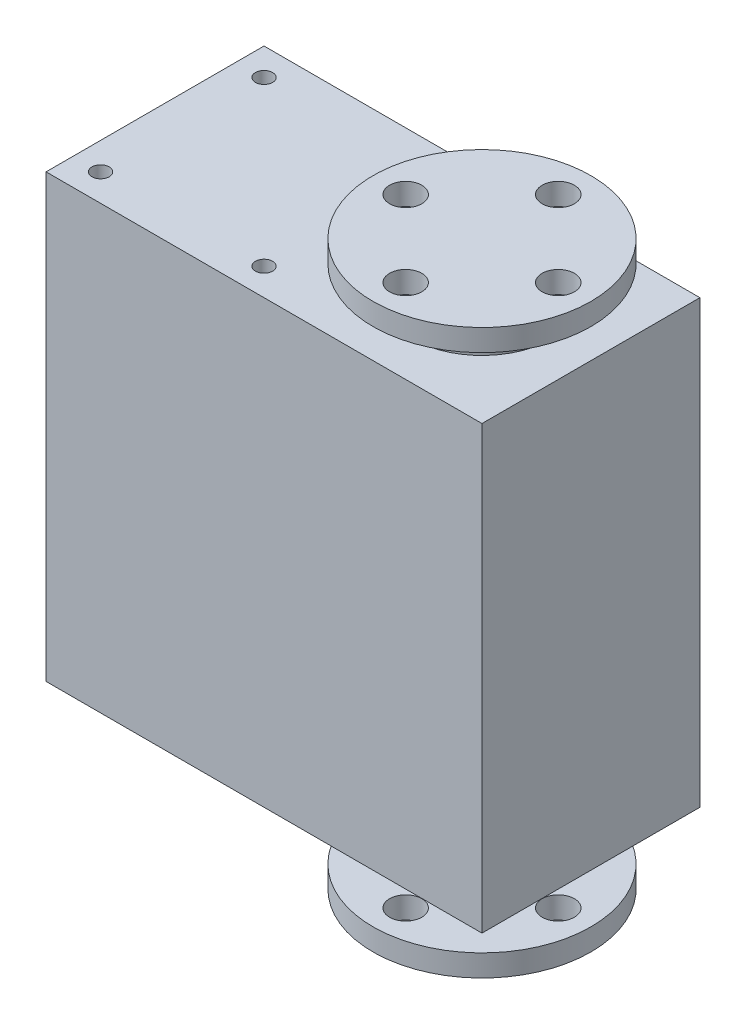
ISO-10303-21;
HEADER;
FILE_DESCRIPTION(('STEP AP214'),'2;1');
FILE_NAME('part.step','',(''),(''),'','','');
FILE_SCHEMA(('AUTOMOTIVE_DESIGN { 1 0 10303 214 1 1 1 1 }'));
ENDSEC;
DATA;
#1=APPLICATION_CONTEXT('core data for automotive mechanical design processes');
#2=APPLICATION_PROTOCOL_DEFINITION('international standard','automotive_design',2000,#1);
#3=PRODUCT_CONTEXT('',#1,'mechanical');
#4=PRODUCT('Part','Part','',(#3));
#5=PRODUCT_RELATED_PRODUCT_CATEGORY('part','',(#4));
#6=PRODUCT_DEFINITION_FORMATION('','',#4);
#7=PRODUCT_DEFINITION_CONTEXT('part definition',#1,'design');
#8=PRODUCT_DEFINITION('design','',#6,#7);
#9=PRODUCT_DEFINITION_SHAPE('','',#8);
#10=(LENGTH_UNIT() NAMED_UNIT(*) SI_UNIT(.MILLI.,.METRE.));
#11=(NAMED_UNIT(*) PLANE_ANGLE_UNIT() SI_UNIT($,.RADIAN.));
#12=(NAMED_UNIT(*) SI_UNIT($,.STERADIAN.) SOLID_ANGLE_UNIT());
#13=UNCERTAINTY_MEASURE_WITH_UNIT(LENGTH_MEASURE(1.E-05),#10,'distance_accuracy_value','');
#14=(GEOMETRIC_REPRESENTATION_CONTEXT(3) GLOBAL_UNCERTAINTY_ASSIGNED_CONTEXT((#13)) GLOBAL_UNIT_ASSIGNED_CONTEXT((#10,
#11,#12)) REPRESENTATION_CONTEXT('',''));
#15=CARTESIAN_POINT('',(0.,0.,0.));
#16=DIRECTION('',(0.,0.,1.));
#17=DIRECTION('',(1.,0.,0.));
#18=AXIS2_PLACEMENT_3D('',#15,#16,#17);
#19=CARTESIAN_POINT('',(0.,0.,20.));
#20=DIRECTION('',(0.,1.,0.));
#21=DIRECTION('',(0.,0.,1.));
#22=AXIS2_PLACEMENT_3D('',#19,#20,#21);
#23=PLANE('',#22);
#24=CARTESIAN_POINT('',(9.8,0.,17.5182537414104));
#25=DIRECTION('',(0.,-1.,0.));
#26=DIRECTION('',(1.,0.,0.));
#27=AXIS2_PLACEMENT_3D('',#24,#25,#26);
#28=CIRCLE('',#27,0.79);
#29=CARTESIAN_POINT('',(10.59,0.,17.5182537414104));
#30=VERTEX_POINT('',#29);
#31=EDGE_CURVE('E239',#30,#30,#28,.T.);
#32=ORIENTED_EDGE('',*,*,#31,.F.);
#33=EDGE_LOOP('',(#32));
#34=FACE_BOUND('',#33,.T.);
#35=CARTESIAN_POINT('',(9.8,0.,3.51825374141041));
#36=DIRECTION('',(0.,-1.,0.));
#37=DIRECTION('',(1.,0.,0.));
#38=AXIS2_PLACEMENT_3D('',#35,#36,#37);
#39=CIRCLE('',#38,0.79);
#40=CARTESIAN_POINT('',(10.59,0.,3.51825374141041));
#41=VERTEX_POINT('',#40);
#42=EDGE_CURVE('E223',#41,#41,#39,.T.);
#43=ORIENTED_EDGE('',*,*,#42,.F.);
#44=EDGE_LOOP('',(#43));
#45=FACE_BOUND('',#44,.T.);
#46=DIRECTION('',(1.,0.,0.));
#47=VECTOR('',#46,1.);
#48=CARTESIAN_POINT('',(0.,0.,0.));
#49=LINE('',#48,#47);
#50=CARTESIAN_POINT('',(0.,0.,0.));
#51=VERTEX_POINT('',#50);
#52=CARTESIAN_POINT('',(40.,0.,0.));
#53=VERTEX_POINT('',#52);
#54=EDGE_CURVE('E82',#51,#53,#49,.T.);
#55=ORIENTED_EDGE('',*,*,#54,.T.);
#56=DIRECTION('',(0.,0.,-1.));
#57=VECTOR('',#56,1.);
#58=CARTESIAN_POINT('',(40.,0.,20.));
#59=LINE('',#58,#57);
#60=CARTESIAN_POINT('',(40.,0.,20.));
#61=VERTEX_POINT('',#60);
#62=EDGE_CURVE('E21',#61,#53,#59,.T.);
#63=ORIENTED_EDGE('',*,*,#62,.F.);
#64=DIRECTION('',(1.,0.,0.));
#65=VECTOR('',#64,1.);
#66=CARTESIAN_POINT('',(0.,0.,20.));
#67=LINE('',#66,#65);
#68=CARTESIAN_POINT('',(0.,0.,20.));
#69=VERTEX_POINT('',#68);
#70=EDGE_CURVE('E64',#69,#61,#67,.T.);
#71=ORIENTED_EDGE('',*,*,#70,.F.);
#72=DIRECTION('',(0.,0.,-1.));
#73=VECTOR('',#72,1.);
#74=CARTESIAN_POINT('',(0.,0.,20.));
#75=LINE('',#74,#73);
#76=EDGE_CURVE('E95',#69,#51,#75,.T.);
#77=ORIENTED_EDGE('',*,*,#76,.T.);
#78=EDGE_LOOP('',(#55,#63,#71,#77));
#79=FACE_BOUND('',#78,.T.);
#80=CARTESIAN_POINT('',(30.,0.,10.));
#81=DIRECTION('',(0.,1.,0.));
#82=DIRECTION('',(1.,0.,0.));
#83=AXIS2_PLACEMENT_3D('',#80,#81,#82);
#84=CIRCLE('',#83,6.5);
#85=CARTESIAN_POINT('',(36.5,0.,10.));
#86=VERTEX_POINT('',#85);
#87=EDGE_CURVE('E111',#86,#86,#84,.T.);
#88=ORIENTED_EDGE('',*,*,#87,.T.);
#89=EDGE_LOOP('',(#88));
#90=FACE_BOUND('',#89,.T.);
#91=CARTESIAN_POINT('',(23.2,0.,2.));
#92=DIRECTION('',(0.,-1.,0.));
#93=DIRECTION('',(1.,0.,0.));
#94=AXIS2_PLACEMENT_3D('',#91,#92,#93);
#95=CIRCLE('',#94,0.79);
#96=CARTESIAN_POINT('',(23.99,0.,2.));
#97=VERTEX_POINT('',#96);
#98=EDGE_CURVE('E215',#97,#97,#95,.T.);
#99=ORIENTED_EDGE('',*,*,#98,.F.);
#100=EDGE_LOOP('',(#99));
#101=FACE_BOUND('',#100,.T.);
#102=CARTESIAN_POINT('',(2.8,0.,10.0430152254788));
#103=DIRECTION('',(0.,-1.,0.));
#104=DIRECTION('',(1.,0.,0.));
#105=AXIS2_PLACEMENT_3D('',#102,#103,#104);
#106=CIRCLE('',#105,0.79);
#107=CARTESIAN_POINT('',(3.59,0.,10.0430152254788));
#108=VERTEX_POINT('',#107);
#109=EDGE_CURVE('E231',#108,#108,#106,.T.);
#110=ORIENTED_EDGE('',*,*,#109,.F.);
#111=EDGE_LOOP('',(#110));
#112=FACE_BOUND('',#111,.T.);
#113=CARTESIAN_POINT('',(23.2,0.,17.21));
#114=DIRECTION('',(0.,-1.,0.));
#115=DIRECTION('',(1.,0.,0.));
#116=AXIS2_PLACEMENT_3D('',#113,#114,#115);
#117=CIRCLE('',#116,0.79);
#118=CARTESIAN_POINT('',(23.99,0.,17.21));
#119=VERTEX_POINT('',#118);
#120=EDGE_CURVE('E247',#119,#119,#117,.T.);
#121=ORIENTED_EDGE('',*,*,#120,.F.);
#122=EDGE_LOOP('',(#121));
#123=FACE_BOUND('',#122,.T.);
#124=ADVANCED_FACE('F17',(#34,#45,#79,#90,#101,#112,#123),#23,.F.);
#125=CARTESIAN_POINT('',(30.,45.2,10.));
#126=DIRECTION('',(0.,1.,0.));
#127=DIRECTION('',(0.,0.,1.));
#128=AXIS2_PLACEMENT_3D('',#125,#126,#127);
#129=PLANE('',#128);
#130=CARTESIAN_POINT('',(30.,45.2,2.99999999999993));
#131=DIRECTION('',(0.,-1.,0.));
#132=DIRECTION('',(-1.,0.,0.));
#133=AXIS2_PLACEMENT_3D('',#130,#131,#132);
#134=CIRCLE('',#133,1.47782604588);
#135=CARTESIAN_POINT('',(28.52217395412,45.2,2.99999999999993));
#136=VERTEX_POINT('',#135);
#137=EDGE_CURVE('E199',#136,#136,#134,.T.);
#138=ORIENTED_EDGE('',*,*,#137,.T.);
#139=EDGE_LOOP('',(#138));
#140=FACE_BOUND('',#139,.T.);
#141=CARTESIAN_POINT('',(30.,45.2,17.));
#142=DIRECTION('',(0.,-1.,0.));
#143=DIRECTION('',(1.,0.,0.));
#144=AXIS2_PLACEMENT_3D('',#141,#142,#143);
#145=CIRCLE('',#144,1.47782604588);
#146=CARTESIAN_POINT('',(31.47782604588,45.2,17.));
#147=VERTEX_POINT('',#146);
#148=EDGE_CURVE('E183',#147,#147,#145,.T.);
#149=ORIENTED_EDGE('',*,*,#148,.T.);
#150=EDGE_LOOP('',(#149));
#151=FACE_BOUND('',#150,.T.);
#152=CARTESIAN_POINT('',(30.,45.2,10.));
#153=DIRECTION('',(0.,1.,0.));
#154=DIRECTION('',(1.,0.,0.));
#155=AXIS2_PLACEMENT_3D('',#152,#153,#154);
#156=CIRCLE('',#155,10.);
#157=CARTESIAN_POINT('',(40.,45.2,10.));
#158=VERTEX_POINT('',#157);
#159=EDGE_CURVE('E130',#158,#158,#156,.T.);
#160=ORIENTED_EDGE('',*,*,#159,.T.);
#161=EDGE_LOOP('',(#160));
#162=FACE_BOUND('',#161,.T.);
#163=CARTESIAN_POINT('',(23.,45.2,10.));
#164=DIRECTION('',(0.,-1.,0.));
#165=DIRECTION('',(0.,0.,1.));
#166=AXIS2_PLACEMENT_3D('',#163,#164,#165);
#167=CIRCLE('',#166,1.47782604588);
#168=CARTESIAN_POINT('',(23.,45.2,11.47782604588));
#169=VERTEX_POINT('',#168);
#170=EDGE_CURVE('E191',#169,#169,#167,.T.);
#171=ORIENTED_EDGE('',*,*,#170,.T.);
#172=EDGE_LOOP('',(#171));
#173=FACE_BOUND('',#172,.T.);
#174=CARTESIAN_POINT('',(37.,45.2,10.));
#175=DIRECTION('',(0.,-1.,0.));
#176=DIRECTION('',(0.,0.,-1.));
#177=AXIS2_PLACEMENT_3D('',#174,#175,#176);
#178=CIRCLE('',#177,1.47782604588);
#179=CARTESIAN_POINT('',(37.,45.2,8.52217395412));
#180=VERTEX_POINT('',#179);
#181=EDGE_CURVE('E207',#180,#180,#178,.T.);
#182=ORIENTED_EDGE('',*,*,#181,.T.);
#183=EDGE_LOOP('',(#182));
#184=FACE_BOUND('',#183,.T.);
#185=ADVANCED_FACE('F325',(#140,#151,#162,#173,#184),#129,.T.);
#186=CARTESIAN_POINT('',(30.,43.2,10.));
#187=DIRECTION('',(0.,1.,0.));
#188=DIRECTION('',(0.,0.,1.));
#189=AXIS2_PLACEMENT_3D('',#186,#187,#188);
#190=PLANE('',#189);
#191=CARTESIAN_POINT('',(30.,43.2,2.99999999999993));
#192=DIRECTION('',(0.,-1.,0.));
#193=DIRECTION('',(-1.,0.,0.));
#194=AXIS2_PLACEMENT_3D('',#191,#192,#193);
#195=CIRCLE('',#194,1.47782604588);
#196=CARTESIAN_POINT('',(28.52217395412,43.2,2.99999999999993));
#197=VERTEX_POINT('',#196);
#198=EDGE_CURVE('E195',#197,#197,#195,.T.);
#199=ORIENTED_EDGE('',*,*,#198,.F.);
#200=EDGE_LOOP('',(#199));
#201=FACE_BOUND('',#200,.T.);
#202=CARTESIAN_POINT('',(30.,43.2,17.));
#203=DIRECTION('',(0.,-1.,0.));
#204=DIRECTION('',(1.,0.,0.));
#205=AXIS2_PLACEMENT_3D('',#202,#203,#204);
#206=CIRCLE('',#205,1.47782604588);
#207=CARTESIAN_POINT('',(31.47782604588,43.2,17.));
#208=VERTEX_POINT('',#207);
#209=EDGE_CURVE('E179',#208,#208,#206,.T.);
#210=ORIENTED_EDGE('',*,*,#209,.F.);
#211=EDGE_LOOP('',(#210));
#212=FACE_BOUND('',#211,.T.);
#213=CARTESIAN_POINT('',(30.,43.2,10.));
#214=DIRECTION('',(0.,-1.,0.));
#215=DIRECTION('',(1.,0.,0.));
#216=AXIS2_PLACEMENT_3D('',#213,#214,#215);
#217=CIRCLE('',#216,4.5);
#218=CARTESIAN_POINT('',(34.5,43.2,10.));
#219=VERTEX_POINT('',#218);
#220=EDGE_CURVE('E126',#219,#219,#217,.T.);
#221=ORIENTED_EDGE('',*,*,#220,.F.);
#222=EDGE_LOOP('',(#221));
#223=FACE_BOUND('',#222,.T.);
#224=CARTESIAN_POINT('',(30.,43.2,10.));
#225=DIRECTION('',(0.,1.,0.));
#226=DIRECTION('',(1.,0.,0.));
#227=AXIS2_PLACEMENT_3D('',#224,#225,#226);
#228=CIRCLE('',#227,10.);
#229=CARTESIAN_POINT('',(40.,43.2,10.));
#230=VERTEX_POINT('',#229);
#231=EDGE_CURVE('E131',#230,#230,#228,.T.);
#232=ORIENTED_EDGE('',*,*,#231,.F.);
#233=EDGE_LOOP('',(#232));
#234=FACE_BOUND('',#233,.T.);
#235=CARTESIAN_POINT('',(23.,43.2,10.));
#236=DIRECTION('',(0.,-1.,0.));
#237=DIRECTION('',(0.,0.,1.));
#238=AXIS2_PLACEMENT_3D('',#235,#236,#237);
#239=CIRCLE('',#238,1.47782604588);
#240=CARTESIAN_POINT('',(23.,43.2,11.47782604588));
#241=VERTEX_POINT('',#240);
#242=EDGE_CURVE('E187',#241,#241,#239,.T.);
#243=ORIENTED_EDGE('',*,*,#242,.F.);
#244=EDGE_LOOP('',(#243));
#245=FACE_BOUND('',#244,.T.);
#246=CARTESIAN_POINT('',(37.,43.2,10.));
#247=DIRECTION('',(0.,-1.,0.));
#248=DIRECTION('',(0.,0.,-1.));
#249=AXIS2_PLACEMENT_3D('',#246,#247,#248);
#250=CIRCLE('',#249,1.47782604588);
#251=CARTESIAN_POINT('',(37.,43.2,8.52217395412));
#252=VERTEX_POINT('',#251);
#253=EDGE_CURVE('E203',#252,#252,#250,.T.);
#254=ORIENTED_EDGE('',*,*,#253,.F.);
#255=EDGE_LOOP('',(#254));
#256=FACE_BOUND('',#255,.T.);
#257=ADVANCED_FACE('F331',(#201,#212,#223,#234,#245,#256),#190,.F.);
#258=CARTESIAN_POINT('',(30.,-6.5,10.));
#259=DIRECTION('',(0.,1.,0.));
#260=DIRECTION('',(0.,0.,1.));
#261=AXIS2_PLACEMENT_3D('',#258,#259,#260);
#262=PLANE('',#261);
#263=CARTESIAN_POINT('',(30.,-6.5,2.99999999999993));
#264=DIRECTION('',(0.,-1.,0.));
#265=DIRECTION('',(-1.,0.,0.));
#266=AXIS2_PLACEMENT_3D('',#263,#264,#265);
#267=CIRCLE('',#266,1.47782604588);
#268=CARTESIAN_POINT('',(28.52217395412,-6.5,2.99999999999993));
#269=VERTEX_POINT('',#268);
#270=EDGE_CURVE('E167',#269,#269,#267,.T.);
#271=ORIENTED_EDGE('',*,*,#270,.F.);
#272=EDGE_LOOP('',(#271));
#273=FACE_BOUND('',#272,.T.);
#274=CARTESIAN_POINT('',(30.,-6.5,17.));
#275=DIRECTION('',(0.,-1.,0.));
#276=DIRECTION('',(1.,0.,0.));
#277=AXIS2_PLACEMENT_3D('',#274,#275,#276);
#278=CIRCLE('',#277,1.47782604588);
#279=CARTESIAN_POINT('',(31.47782604588,-6.5,17.));
#280=VERTEX_POINT('',#279);
#281=EDGE_CURVE('E151',#280,#280,#278,.T.);
#282=ORIENTED_EDGE('',*,*,#281,.F.);
#283=EDGE_LOOP('',(#282));
#284=FACE_BOUND('',#283,.T.);
#285=CARTESIAN_POINT('',(30.,-6.5,10.));
#286=DIRECTION('',(0.,1.,0.));
#287=DIRECTION('',(1.,0.,0.));
#288=AXIS2_PLACEMENT_3D('',#285,#286,#287);
#289=CIRCLE('',#288,10.);
#290=CARTESIAN_POINT('',(40.,-6.5,10.));
#291=VERTEX_POINT('',#290);
#292=EDGE_CURVE('E142',#291,#291,#289,.T.);
#293=ORIENTED_EDGE('',*,*,#292,.F.);
#294=EDGE_LOOP('',(#293));
#295=FACE_BOUND('',#294,.T.);
#296=CARTESIAN_POINT('',(23.,-6.5,10.));
#297=DIRECTION('',(0.,-1.,0.));
#298=DIRECTION('',(0.,0.,1.));
#299=AXIS2_PLACEMENT_3D('',#296,#297,#298);
#300=CIRCLE('',#299,1.47782604588);
#301=CARTESIAN_POINT('',(23.,-6.5,11.47782604588));
#302=VERTEX_POINT('',#301);
#303=EDGE_CURVE('E159',#302,#302,#300,.T.);
#304=ORIENTED_EDGE('',*,*,#303,.F.);
#305=EDGE_LOOP('',(#304));
#306=FACE_BOUND('',#305,.T.);
#307=CARTESIAN_POINT('',(37.,-6.5,10.));
#308=DIRECTION('',(0.,-1.,0.));
#309=DIRECTION('',(0.,0.,-1.));
#310=AXIS2_PLACEMENT_3D('',#307,#308,#309);
#311=CIRCLE('',#310,1.47782604588);
#312=CARTESIAN_POINT('',(37.,-6.5,8.52217395412));
#313=VERTEX_POINT('',#312);
#314=EDGE_CURVE('E175',#313,#313,#311,.T.);
#315=ORIENTED_EDGE('',*,*,#314,.F.);
#316=EDGE_LOOP('',(#315));
#317=FACE_BOUND('',#316,.T.);
#318=ADVANCED_FACE('F376',(#273,#284,#295,#306,#317),#262,.F.);
#319=CARTESIAN_POINT('',(30.,-4.5,10.));
#320=DIRECTION('',(0.,1.,0.));
#321=DIRECTION('',(0.,0.,1.));
#322=AXIS2_PLACEMENT_3D('',#319,#320,#321);
#323=PLANE('',#322);
#324=CARTESIAN_POINT('',(30.,-4.5,2.99999999999993));
#325=DIRECTION('',(0.,-1.,0.));
#326=DIRECTION('',(-1.,0.,0.));
#327=AXIS2_PLACEMENT_3D('',#324,#325,#326);
#328=CIRCLE('',#327,1.47782604588);
#329=CARTESIAN_POINT('',(28.52217395412,-4.5,2.99999999999993));
#330=VERTEX_POINT('',#329);
#331=EDGE_CURVE('E163',#330,#330,#328,.T.);
#332=ORIENTED_EDGE('',*,*,#331,.T.);
#333=EDGE_LOOP('',(#332));
#334=FACE_BOUND('',#333,.T.);
#335=CARTESIAN_POINT('',(30.,-4.5,17.));
#336=DIRECTION('',(0.,-1.,0.));
#337=DIRECTION('',(1.,0.,0.));
#338=AXIS2_PLACEMENT_3D('',#335,#336,#337);
#339=CIRCLE('',#338,1.47782604588);
#340=CARTESIAN_POINT('',(31.47782604588,-4.5,17.));
#341=VERTEX_POINT('',#340);
#342=EDGE_CURVE('E147',#341,#341,#339,.T.);
#343=ORIENTED_EDGE('',*,*,#342,.T.);
#344=EDGE_LOOP('',(#343));
#345=FACE_BOUND('',#344,.T.);
#346=CARTESIAN_POINT('',(30.,-4.5,10.));
#347=DIRECTION('',(0.,-1.,0.));
#348=DIRECTION('',(1.,0.,0.));
#349=AXIS2_PLACEMENT_3D('',#346,#347,#348);
#350=CIRCLE('',#349,4.5);
#351=CARTESIAN_POINT('',(34.5,-4.5,10.));
#352=VERTEX_POINT('',#351);
#353=EDGE_CURVE('E135',#352,#352,#350,.T.);
#354=ORIENTED_EDGE('',*,*,#353,.T.);
#355=EDGE_LOOP('',(#354));
#356=FACE_BOUND('',#355,.T.);
#357=CARTESIAN_POINT('',(30.,-4.5,10.));
#358=DIRECTION('',(0.,1.,0.));
#359=DIRECTION('',(1.,0.,0.));
#360=AXIS2_PLACEMENT_3D('',#357,#358,#359);
#361=CIRCLE('',#360,10.);
#362=CARTESIAN_POINT('',(40.,-4.5,10.));
#363=VERTEX_POINT('',#362);
#364=EDGE_CURVE('E143',#363,#363,#361,.T.);
#365=ORIENTED_EDGE('',*,*,#364,.T.);
#366=EDGE_LOOP('',(#365));
#367=FACE_BOUND('',#366,.T.);
#368=CARTESIAN_POINT('',(23.,-4.5,10.));
#369=DIRECTION('',(0.,-1.,0.));
#370=DIRECTION('',(0.,0.,1.));
#371=AXIS2_PLACEMENT_3D('',#368,#369,#370);
#372=CIRCLE('',#371,1.47782604588);
#373=CARTESIAN_POINT('',(23.,-4.5,11.47782604588));
#374=VERTEX_POINT('',#373);
#375=EDGE_CURVE('E155',#374,#374,#372,.T.);
#376=ORIENTED_EDGE('',*,*,#375,.T.);
#377=EDGE_LOOP('',(#376));
#378=FACE_BOUND('',#377,.T.);
#379=CARTESIAN_POINT('',(37.,-4.5,10.));
#380=DIRECTION('',(0.,-1.,0.));
#381=DIRECTION('',(0.,0.,-1.));
#382=AXIS2_PLACEMENT_3D('',#379,#380,#381);
#383=CIRCLE('',#382,1.47782604588);
#384=CARTESIAN_POINT('',(37.,-4.5,8.52217395412));
#385=VERTEX_POINT('',#384);
#386=EDGE_CURVE('E171',#385,#385,#383,.T.);
#387=ORIENTED_EDGE('',*,*,#386,.T.);
#388=EDGE_LOOP('',(#387));
#389=FACE_BOUND('',#388,.T.);
#390=ADVANCED_FACE('F368',(#334,#345,#356,#367,#378,#389),#323,.T.);
#391=CARTESIAN_POINT('',(30.,-1.,10.));
#392=DIRECTION('',(0.,1.,0.));
#393=DIRECTION('',(0.,0.,1.));
#394=AXIS2_PLACEMENT_3D('',#391,#392,#393);
#395=PLANE('',#394);
#396=CARTESIAN_POINT('',(30.,-1.,10.));
#397=DIRECTION('',(0.,1.,0.));
#398=DIRECTION('',(1.,0.,0.));
#399=AXIS2_PLACEMENT_3D('',#396,#397,#398);
#400=CIRCLE('',#399,6.5);
#401=CARTESIAN_POINT('',(36.5,-1.,10.));
#402=VERTEX_POINT('',#401);
#403=EDGE_CURVE('E107',#402,#402,#400,.T.);
#404=ORIENTED_EDGE('',*,*,#403,.F.);
#405=EDGE_LOOP('',(#404));
#406=FACE_BOUND('',#405,.T.);
#407=CARTESIAN_POINT('',(30.,-1.,10.));
#408=DIRECTION('',(0.,-1.,0.));
#409=DIRECTION('',(1.,0.,0.));
#410=AXIS2_PLACEMENT_3D('',#407,#408,#409);
#411=CIRCLE('',#410,4.5);
#412=CARTESIAN_POINT('',(34.5,-1.,10.));
#413=VERTEX_POINT('',#412);
#414=EDGE_CURVE('E11',#413,#413,#411,.T.);
#415=ORIENTED_EDGE('',*,*,#414,.F.);
#416=EDGE_LOOP('',(#415));
#417=FACE_BOUND('',#416,.T.);
#418=ADVANCED_FACE('F360',(#406,#417),#395,.F.);
#419=CARTESIAN_POINT('',(30.,41.5,10.));
#420=DIRECTION('',(0.,1.,0.));
#421=DIRECTION('',(0.,0.,1.));
#422=AXIS2_PLACEMENT_3D('',#419,#420,#421);
#423=PLANE('',#422);
#424=CARTESIAN_POINT('',(30.,41.5,10.));
#425=DIRECTION('',(0.,1.,0.));
#426=DIRECTION('',(1.,0.,0.));
#427=AXIS2_PLACEMENT_3D('',#424,#425,#426);
#428=CIRCLE('',#427,6.5);
#429=CARTESIAN_POINT('',(36.5,41.5,10.));
#430=VERTEX_POINT('',#429);
#431=EDGE_CURVE('E115',#430,#430,#428,.T.);
#432=ORIENTED_EDGE('',*,*,#431,.T.);
#433=EDGE_LOOP('',(#432));
#434=FACE_BOUND('',#433,.T.);
#435=CARTESIAN_POINT('',(30.,41.5,10.));
#436=DIRECTION('',(0.,-1.,0.));
#437=DIRECTION('',(1.,0.,0.));
#438=AXIS2_PLACEMENT_3D('',#435,#436,#437);
#439=CIRCLE('',#438,4.5);
#440=CARTESIAN_POINT('',(34.5,41.5,10.));
#441=VERTEX_POINT('',#440);
#442=EDGE_CURVE('E122',#441,#441,#439,.T.);
#443=ORIENTED_EDGE('',*,*,#442,.T.);
#444=EDGE_LOOP('',(#443));
#445=FACE_BOUND('',#444,.T.);
#446=ADVANCED_FACE('F299',(#434,#445),#423,.T.);
#447=CARTESIAN_POINT('',(40.,40.5,20.));
#448=DIRECTION('',(0.,-1.,0.));
#449=DIRECTION('',(0.,0.,-1.));
#450=AXIS2_PLACEMENT_3D('',#447,#448,#449);
#451=PLANE('',#450);
#452=CARTESIAN_POINT('',(17.5,40.5,17.5));
#453=DIRECTION('',(0.,-1.,0.));
#454=DIRECTION('',(1.,0.,0.));
#455=AXIS2_PLACEMENT_3D('',#452,#453,#454);
#456=CIRCLE('',#455,0.79);
#457=CARTESIAN_POINT('',(18.29,40.5,17.5));
#458=VERTEX_POINT('',#457);
#459=EDGE_CURVE('E279',#458,#458,#456,.T.);
#460=ORIENTED_EDGE('',*,*,#459,.T.);
#461=EDGE_LOOP('',(#460));
#462=FACE_BOUND('',#461,.T.);
#463=CARTESIAN_POINT('',(2.5,40.5,17.5));
#464=DIRECTION('',(0.,-1.,0.));
#465=DIRECTION('',(1.,0.,0.));
#466=AXIS2_PLACEMENT_3D('',#463,#464,#465);
#467=CIRCLE('',#466,0.79);
#468=CARTESIAN_POINT('',(3.29,40.5,17.5));
#469=VERTEX_POINT('',#468);
#470=EDGE_CURVE('E271',#469,#469,#467,.T.);
#471=ORIENTED_EDGE('',*,*,#470,.T.);
#472=EDGE_LOOP('',(#471));
#473=FACE_BOUND('',#472,.T.);
#474=CARTESIAN_POINT('',(2.5,40.5,2.5));
#475=DIRECTION('',(0.,-1.,0.));
#476=DIRECTION('',(1.,0.,0.));
#477=AXIS2_PLACEMENT_3D('',#474,#475,#476);
#478=CIRCLE('',#477,0.79);
#479=CARTESIAN_POINT('',(3.29,40.5,2.5));
#480=VERTEX_POINT('',#479);
#481=EDGE_CURVE('E263',#480,#480,#478,.T.);
#482=ORIENTED_EDGE('',*,*,#481,.T.);
#483=EDGE_LOOP('',(#482));
#484=FACE_BOUND('',#483,.T.);
#485=CARTESIAN_POINT('',(17.5,40.5,2.5));
#486=DIRECTION('',(0.,-1.,0.));
#487=DIRECTION('',(1.,0.,0.));
#488=AXIS2_PLACEMENT_3D('',#485,#486,#487);
#489=CIRCLE('',#488,0.79);
#490=CARTESIAN_POINT('',(18.29,40.5,2.5));
#491=VERTEX_POINT('',#490);
#492=EDGE_CURVE('E255',#491,#491,#489,.T.);
#493=ORIENTED_EDGE('',*,*,#492,.T.);
#494=EDGE_LOOP('',(#493));
#495=FACE_BOUND('',#494,.T.);
#496=DIRECTION('',(-1.,0.,0.));
#497=VECTOR('',#496,1.);
#498=CARTESIAN_POINT('',(40.,40.5,0.));
#499=LINE('',#498,#497);
#500=CARTESIAN_POINT('',(40.,40.5,0.));
#501=VERTEX_POINT('',#500);
#502=CARTESIAN_POINT('',(0.,40.5,0.));
#503=VERTEX_POINT('',#502);
#504=EDGE_CURVE('E53',#501,#503,#499,.T.);
#505=ORIENTED_EDGE('',*,*,#504,.T.);
#506=DIRECTION('',(0.,0.,-1.));
#507=VECTOR('',#506,1.);
#508=CARTESIAN_POINT('',(0.,40.5,20.));
#509=LINE('',#508,#507);
#510=CARTESIAN_POINT('',(0.,40.5,20.));
#511=VERTEX_POINT('',#510);
#512=EDGE_CURVE('E73',#511,#503,#509,.T.);
#513=ORIENTED_EDGE('',*,*,#512,.F.);
#514=DIRECTION('',(-1.,0.,0.));
#515=VECTOR('',#514,1.);
#516=CARTESIAN_POINT('',(40.,40.5,20.));
#517=LINE('',#516,#515);
#518=CARTESIAN_POINT('',(40.,40.5,20.));
#519=VERTEX_POINT('',#518);
#520=EDGE_CURVE('E67',#519,#511,#517,.T.);
#521=ORIENTED_EDGE('',*,*,#520,.F.);
#522=DIRECTION('',(0.,0.,-1.));
#523=VECTOR('',#522,1.);
#524=CARTESIAN_POINT('',(40.,40.5,20.));
#525=LINE('',#524,#523);
#526=EDGE_CURVE('E71',#519,#501,#525,.T.);
#527=ORIENTED_EDGE('',*,*,#526,.T.);
#528=EDGE_LOOP('',(#505,#513,#521,#527));
#529=FACE_BOUND('',#528,.T.);
#530=CARTESIAN_POINT('',(30.,40.5,10.));
#531=DIRECTION('',(0.,1.,0.));
#532=DIRECTION('',(1.,0.,0.));
#533=AXIS2_PLACEMENT_3D('',#530,#531,#532);
#534=CIRCLE('',#533,6.5);
#535=CARTESIAN_POINT('',(36.5,40.5,10.));
#536=VERTEX_POINT('',#535);
#537=EDGE_CURVE('E28',#536,#536,#534,.T.);
#538=ORIENTED_EDGE('',*,*,#537,.F.);
#539=EDGE_LOOP('',(#538));
#540=FACE_BOUND('',#539,.T.);
#541=ADVANCED_FACE('F68',(#462,#473,#484,#495,#529,#540),#451,.F.);
#542=CARTESIAN_POINT('',(40.,0.,20.));
#543=DIRECTION('',(-1.,0.,0.));
#544=DIRECTION('',(0.,0.,1.));
#545=AXIS2_PLACEMENT_3D('',#542,#543,#544);
#546=PLANE('',#545);
#547=DIRECTION('',(0.,1.,0.));
#548=VECTOR('',#547,1.);
#549=CARTESIAN_POINT('',(40.,0.,0.));
#550=LINE('',#549,#548);
#551=EDGE_CURVE('E85',#53,#501,#550,.T.);
#552=ORIENTED_EDGE('',*,*,#551,.T.);
#553=ORIENTED_EDGE('',*,*,#526,.F.);
#554=DIRECTION('',(0.,1.,0.));
#555=VECTOR('',#554,1.);
#556=CARTESIAN_POINT('',(40.,0.,20.));
#557=LINE('',#556,#555);
#558=EDGE_CURVE('E75',#61,#519,#557,.T.);
#559=ORIENTED_EDGE('',*,*,#558,.F.);
#560=ORIENTED_EDGE('',*,*,#62,.T.);
#561=EDGE_LOOP('',(#552,#553,#559,#560));
#562=FACE_BOUND('',#561,.T.);
#563=ADVANCED_FACE('F19',(#562),#546,.F.);
#564=CARTESIAN_POINT('',(0.,40.5,20.));
#565=DIRECTION('',(1.,0.,0.));
#566=DIRECTION('',(0.,0.,-1.));
#567=AXIS2_PLACEMENT_3D('',#564,#565,#566);
#568=PLANE('',#567);
#569=DIRECTION('',(0.,-1.,0.));
#570=VECTOR('',#569,1.);
#571=CARTESIAN_POINT('',(0.,40.5,0.));
#572=LINE('',#571,#570);
#573=EDGE_CURVE('E59',#503,#51,#572,.T.);
#574=ORIENTED_EDGE('',*,*,#573,.T.);
#575=ORIENTED_EDGE('',*,*,#76,.F.);
#576=DIRECTION('',(0.,-1.,0.));
#577=VECTOR('',#576,1.);
#578=CARTESIAN_POINT('',(0.,40.5,20.));
#579=LINE('',#578,#577);
#580=EDGE_CURVE('E37',#511,#69,#579,.T.);
#581=ORIENTED_EDGE('',*,*,#580,.F.);
#582=ORIENTED_EDGE('',*,*,#512,.T.);
#583=EDGE_LOOP('',(#574,#575,#581,#582));
#584=FACE_BOUND('',#583,.T.);
#585=ADVANCED_FACE('F340',(#584),#568,.F.);
#586=CARTESIAN_POINT('',(0.,0.,20.));
#587=DIRECTION('',(0.,0.,1.));
#588=DIRECTION('',(1.,0.,0.));
#589=AXIS2_PLACEMENT_3D('',#586,#587,#588);
#590=PLANE('',#589);
#591=ORIENTED_EDGE('',*,*,#558,.T.);
#592=ORIENTED_EDGE('',*,*,#520,.T.);
#593=ORIENTED_EDGE('',*,*,#580,.T.);
#594=ORIENTED_EDGE('',*,*,#70,.T.);
#595=EDGE_LOOP('',(#591,#592,#593,#594));
#596=FACE_BOUND('',#595,.T.);
#597=ADVANCED_FACE('F78',(#596),#590,.T.);
#598=CARTESIAN_POINT('',(0.,0.,0.));
#599=DIRECTION('',(0.,0.,1.));
#600=DIRECTION('',(1.,0.,0.));
#601=AXIS2_PLACEMENT_3D('',#598,#599,#600);
#602=PLANE('',#601);
#603=ORIENTED_EDGE('',*,*,#551,.F.);
#604=ORIENTED_EDGE('',*,*,#54,.F.);
#605=ORIENTED_EDGE('',*,*,#573,.F.);
#606=ORIENTED_EDGE('',*,*,#504,.F.);
#607=EDGE_LOOP('',(#603,#604,#605,#606));
#608=FACE_BOUND('',#607,.T.);
#609=ADVANCED_FACE('F338',(#608),#602,.F.);
#610=CARTESIAN_POINT('',(30.,-1.,10.));
#611=DIRECTION('',(0.,1.,0.));
#612=DIRECTION('',(0.,0.,1.));
#613=AXIS2_PLACEMENT_3D('',#610,#611,#612);
#614=CYLINDRICAL_SURFACE('',#613,6.5);
#615=ORIENTED_EDGE('',*,*,#403,.T.);
#616=EDGE_LOOP('',(#615));
#617=FACE_BOUND('',#616,.T.);
#618=ORIENTED_EDGE('',*,*,#87,.F.);
#619=EDGE_LOOP('',(#618));
#620=FACE_BOUND('',#619,.T.);
#621=ADVANCED_FACE('F490',(#617,#620),#614,.T.);
#622=CARTESIAN_POINT('',(30.,41.5,10.));
#623=DIRECTION('',(0.,-1.,0.));
#624=DIRECTION('',(0.,0.,-1.));
#625=AXIS2_PLACEMENT_3D('',#622,#623,#624);
#626=CYLINDRICAL_SURFACE('',#625,6.5);
#627=ORIENTED_EDGE('',*,*,#431,.F.);
#628=EDGE_LOOP('',(#627));
#629=FACE_BOUND('',#628,.T.);
#630=ORIENTED_EDGE('',*,*,#537,.T.);
#631=EDGE_LOOP('',(#630));
#632=FACE_BOUND('',#631,.T.);
#633=ADVANCED_FACE('F500',(#629,#632),#626,.T.);
#634=CARTESIAN_POINT('',(30.,43.2,10.));
#635=DIRECTION('',(0.,-1.,0.));
#636=DIRECTION('',(0.,0.,-1.));
#637=AXIS2_PLACEMENT_3D('',#634,#635,#636);
#638=CYLINDRICAL_SURFACE('',#637,4.5);
#639=ORIENTED_EDGE('',*,*,#220,.T.);
#640=EDGE_LOOP('',(#639));
#641=FACE_BOUND('',#640,.T.);
#642=ORIENTED_EDGE('',*,*,#442,.F.);
#643=EDGE_LOOP('',(#642));
#644=FACE_BOUND('',#643,.T.);
#645=ADVANCED_FACE('F511',(#641,#644),#638,.T.);
#646=CARTESIAN_POINT('',(30.,45.2,10.));
#647=DIRECTION('',(0.,-1.,0.));
#648=DIRECTION('',(0.,0.,-1.));
#649=AXIS2_PLACEMENT_3D('',#646,#647,#648);
#650=CYLINDRICAL_SURFACE('',#649,10.);
#651=ORIENTED_EDGE('',*,*,#159,.F.);
#652=EDGE_LOOP('',(#651));
#653=FACE_BOUND('',#652,.T.);
#654=ORIENTED_EDGE('',*,*,#231,.T.);
#655=EDGE_LOOP('',(#654));
#656=FACE_BOUND('',#655,.T.);
#657=ADVANCED_FACE('F522',(#653,#656),#650,.T.);
#658=CARTESIAN_POINT('',(30.,-4.5,10.));
#659=DIRECTION('',(0.,1.,0.));
#660=DIRECTION('',(0.,0.,1.));
#661=AXIS2_PLACEMENT_3D('',#658,#659,#660);
#662=CYLINDRICAL_SURFACE('',#661,4.5);
#663=ORIENTED_EDGE('',*,*,#353,.F.);
#664=EDGE_LOOP('',(#663));
#665=FACE_BOUND('',#664,.T.);
#666=ORIENTED_EDGE('',*,*,#414,.T.);
#667=EDGE_LOOP('',(#666));
#668=FACE_BOUND('',#667,.T.);
#669=ADVANCED_FACE('F533',(#665,#668),#662,.T.);
#670=CARTESIAN_POINT('',(30.,-6.5,10.));
#671=DIRECTION('',(0.,1.,0.));
#672=DIRECTION('',(0.,0.,1.));
#673=AXIS2_PLACEMENT_3D('',#670,#671,#672);
#674=CYLINDRICAL_SURFACE('',#673,10.);
#675=ORIENTED_EDGE('',*,*,#292,.T.);
#676=EDGE_LOOP('',(#675));
#677=FACE_BOUND('',#676,.T.);
#678=ORIENTED_EDGE('',*,*,#364,.F.);
#679=EDGE_LOOP('',(#678));
#680=FACE_BOUND('',#679,.T.);
#681=ADVANCED_FACE('F544',(#677,#680),#674,.T.);
#682=CARTESIAN_POINT('',(30.,-4.5,17.));
#683=DIRECTION('',(0.,-1.,0.));
#684=DIRECTION('',(0.,0.,-1.));
#685=AXIS2_PLACEMENT_3D('',#682,#683,#684);
#686=CYLINDRICAL_SURFACE('',#685,1.47782604588);
#687=ORIENTED_EDGE('',*,*,#342,.F.);
#688=EDGE_LOOP('',(#687));
#689=FACE_BOUND('',#688,.T.);
#690=ORIENTED_EDGE('',*,*,#281,.T.);
#691=EDGE_LOOP('',(#690));
#692=FACE_BOUND('',#691,.T.);
#693=ADVANCED_FACE('F555',(#689,#692),#686,.F.);
#694=CARTESIAN_POINT('',(23.,-4.5,10.));
#695=DIRECTION('',(0.,-1.,0.));
#696=DIRECTION('',(0.,0.,-1.));
#697=AXIS2_PLACEMENT_3D('',#694,#695,#696);
#698=CYLINDRICAL_SURFACE('',#697,1.47782604588);
#699=ORIENTED_EDGE('',*,*,#375,.F.);
#700=EDGE_LOOP('',(#699));
#701=FACE_BOUND('',#700,.T.);
#702=ORIENTED_EDGE('',*,*,#303,.T.);
#703=EDGE_LOOP('',(#702));
#704=FACE_BOUND('',#703,.T.);
#705=ADVANCED_FACE('F567',(#701,#704),#698,.F.);
#706=CARTESIAN_POINT('',(30.,-4.5,2.99999999999993));
#707=DIRECTION('',(0.,-1.,0.));
#708=DIRECTION('',(0.,0.,-1.));
#709=AXIS2_PLACEMENT_3D('',#706,#707,#708);
#710=CYLINDRICAL_SURFACE('',#709,1.47782604588);
#711=ORIENTED_EDGE('',*,*,#331,.F.);
#712=EDGE_LOOP('',(#711));
#713=FACE_BOUND('',#712,.T.);
#714=ORIENTED_EDGE('',*,*,#270,.T.);
#715=EDGE_LOOP('',(#714));
#716=FACE_BOUND('',#715,.T.);
#717=ADVANCED_FACE('F580',(#713,#716),#710,.F.);
#718=CARTESIAN_POINT('',(37.,-4.5,10.));
#719=DIRECTION('',(0.,-1.,0.));
#720=DIRECTION('',(0.,0.,-1.));
#721=AXIS2_PLACEMENT_3D('',#718,#719,#720);
#722=CYLINDRICAL_SURFACE('',#721,1.47782604588);
#723=ORIENTED_EDGE('',*,*,#386,.F.);
#724=EDGE_LOOP('',(#723));
#725=FACE_BOUND('',#724,.T.);
#726=ORIENTED_EDGE('',*,*,#314,.T.);
#727=EDGE_LOOP('',(#726));
#728=FACE_BOUND('',#727,.T.);
#729=ADVANCED_FACE('F592',(#725,#728),#722,.F.);
#730=CARTESIAN_POINT('',(30.,43.2,17.));
#731=DIRECTION('',(0.,1.,0.));
#732=DIRECTION('',(0.,0.,1.));
#733=AXIS2_PLACEMENT_3D('',#730,#731,#732);
#734=CYLINDRICAL_SURFACE('',#733,1.47782604588);
#735=ORIENTED_EDGE('',*,*,#209,.T.);
#736=EDGE_LOOP('',(#735));
#737=FACE_BOUND('',#736,.T.);
#738=ORIENTED_EDGE('',*,*,#148,.F.);
#739=EDGE_LOOP('',(#738));
#740=FACE_BOUND('',#739,.T.);
#741=ADVANCED_FACE('F603',(#737,#740),#734,.F.);
#742=CARTESIAN_POINT('',(23.,43.2,10.));
#743=DIRECTION('',(0.,1.,0.));
#744=DIRECTION('',(0.,0.,1.));
#745=AXIS2_PLACEMENT_3D('',#742,#743,#744);
#746=CYLINDRICAL_SURFACE('',#745,1.47782604588);
#747=ORIENTED_EDGE('',*,*,#242,.T.);
#748=EDGE_LOOP('',(#747));
#749=FACE_BOUND('',#748,.T.);
#750=ORIENTED_EDGE('',*,*,#170,.F.);
#751=EDGE_LOOP('',(#750));
#752=FACE_BOUND('',#751,.T.);
#753=ADVANCED_FACE('F614',(#749,#752),#746,.F.);
#754=CARTESIAN_POINT('',(30.,43.2,2.99999999999993));
#755=DIRECTION('',(0.,1.,0.));
#756=DIRECTION('',(0.,0.,1.));
#757=AXIS2_PLACEMENT_3D('',#754,#755,#756);
#758=CYLINDRICAL_SURFACE('',#757,1.47782604588);
#759=ORIENTED_EDGE('',*,*,#198,.T.);
#760=EDGE_LOOP('',(#759));
#761=FACE_BOUND('',#760,.T.);
#762=ORIENTED_EDGE('',*,*,#137,.F.);
#763=EDGE_LOOP('',(#762));
#764=FACE_BOUND('',#763,.T.);
#765=ADVANCED_FACE('F627',(#761,#764),#758,.F.);
#766=CARTESIAN_POINT('',(37.,43.2,10.));
#767=DIRECTION('',(0.,1.,0.));
#768=DIRECTION('',(0.,0.,1.));
#769=AXIS2_PLACEMENT_3D('',#766,#767,#768);
#770=CYLINDRICAL_SURFACE('',#769,1.47782604588);
#771=ORIENTED_EDGE('',*,*,#253,.T.);
#772=EDGE_LOOP('',(#771));
#773=FACE_BOUND('',#772,.T.);
#774=ORIENTED_EDGE('',*,*,#181,.F.);
#775=EDGE_LOOP('',(#774));
#776=FACE_BOUND('',#775,.T.);
#777=ADVANCED_FACE('F640',(#773,#776),#770,.F.);
#778=CARTESIAN_POINT('',(23.2,5.,2.));
#779=DIRECTION('',(0.,-1.,0.));
#780=DIRECTION('',(0.,0.,-1.));
#781=AXIS2_PLACEMENT_3D('',#778,#779,#780);
#782=CYLINDRICAL_SURFACE('',#781,0.79);
#783=CARTESIAN_POINT('',(23.2,5.,2.));
#784=DIRECTION('',(0.,-1.,0.));
#785=DIRECTION('',(1.,0.,0.));
#786=AXIS2_PLACEMENT_3D('',#783,#784,#785);
#787=CIRCLE('',#786,0.79);
#788=CARTESIAN_POINT('',(23.99,5.,2.));
#789=VERTEX_POINT('',#788);
#790=EDGE_CURVE('E211',#789,#789,#787,.F.);
#791=ORIENTED_EDGE('',*,*,#790,.T.);
#792=EDGE_LOOP('',(#791));
#793=FACE_BOUND('',#792,.T.);
#794=ORIENTED_EDGE('',*,*,#98,.T.);
#795=EDGE_LOOP('',(#794));
#796=FACE_BOUND('',#795,.T.);
#797=ADVANCED_FACE('F651',(#793,#796),#782,.F.);
#798=CARTESIAN_POINT('',(23.2,5.,2.));
#799=DIRECTION('',(0.,-1.,0.));
#800=DIRECTION('',(0.,0.,-1.));
#801=AXIS2_PLACEMENT_3D('',#798,#799,#800);
#802=PLANE('',#801);
#803=ORIENTED_EDGE('',*,*,#790,.F.);
#804=EDGE_LOOP('',(#803));
#805=FACE_BOUND('',#804,.T.);
#806=ADVANCED_FACE('F663',(#805),#802,.T.);
#807=CARTESIAN_POINT('',(9.8,5.,3.51825374141041));
#808=DIRECTION('',(0.,-1.,0.));
#809=DIRECTION('',(0.,0.,-1.));
#810=AXIS2_PLACEMENT_3D('',#807,#808,#809);
#811=CYLINDRICAL_SURFACE('',#810,0.79);
#812=CARTESIAN_POINT('',(9.8,5.,3.51825374141041));
#813=DIRECTION('',(0.,-1.,0.));
#814=DIRECTION('',(1.,0.,0.));
#815=AXIS2_PLACEMENT_3D('',#812,#813,#814);
#816=CIRCLE('',#815,0.79);
#817=CARTESIAN_POINT('',(10.59,5.,3.51825374141041));
#818=VERTEX_POINT('',#817);
#819=EDGE_CURVE('E219',#818,#818,#816,.F.);
#820=ORIENTED_EDGE('',*,*,#819,.T.);
#821=EDGE_LOOP('',(#820));
#822=FACE_BOUND('',#821,.T.);
#823=ORIENTED_EDGE('',*,*,#42,.T.);
#824=EDGE_LOOP('',(#823));
#825=FACE_BOUND('',#824,.T.);
#826=ADVANCED_FACE('F677',(#822,#825),#811,.F.);
#827=CARTESIAN_POINT('',(9.8,5.,3.51825374141041));
#828=DIRECTION('',(0.,-1.,0.));
#829=DIRECTION('',(0.,0.,-1.));
#830=AXIS2_PLACEMENT_3D('',#827,#828,#829);
#831=PLANE('',#830);
#832=ORIENTED_EDGE('',*,*,#819,.F.);
#833=EDGE_LOOP('',(#832));
#834=FACE_BOUND('',#833,.T.);
#835=ADVANCED_FACE('F690',(#834),#831,.T.);
#836=CARTESIAN_POINT('',(2.8,5.,10.0430152254788));
#837=DIRECTION('',(0.,-1.,0.));
#838=DIRECTION('',(0.,0.,-1.));
#839=AXIS2_PLACEMENT_3D('',#836,#837,#838);
#840=CYLINDRICAL_SURFACE('',#839,0.79);
#841=CARTESIAN_POINT('',(2.8,5.,10.0430152254788));
#842=DIRECTION('',(0.,-1.,0.));
#843=DIRECTION('',(1.,0.,0.));
#844=AXIS2_PLACEMENT_3D('',#841,#842,#843);
#845=CIRCLE('',#844,0.79);
#846=CARTESIAN_POINT('',(3.59,5.,10.0430152254788));
#847=VERTEX_POINT('',#846);
#848=EDGE_CURVE('E227',#847,#847,#845,.F.);
#849=ORIENTED_EDGE('',*,*,#848,.T.);
#850=EDGE_LOOP('',(#849));
#851=FACE_BOUND('',#850,.T.);
#852=ORIENTED_EDGE('',*,*,#109,.T.);
#853=EDGE_LOOP('',(#852));
#854=FACE_BOUND('',#853,.T.);
#855=ADVANCED_FACE('F702',(#851,#854),#840,.F.);
#856=CARTESIAN_POINT('',(2.8,5.,10.0430152254788));
#857=DIRECTION('',(0.,-1.,0.));
#858=DIRECTION('',(0.,0.,-1.));
#859=AXIS2_PLACEMENT_3D('',#856,#857,#858);
#860=PLANE('',#859);
#861=ORIENTED_EDGE('',*,*,#848,.F.);
#862=EDGE_LOOP('',(#861));
#863=FACE_BOUND('',#862,.T.);
#864=ADVANCED_FACE('F714',(#863),#860,.T.);
#865=CARTESIAN_POINT('',(9.8,5.,17.5182537414104));
#866=DIRECTION('',(0.,-1.,0.));
#867=DIRECTION('',(0.,0.,-1.));
#868=AXIS2_PLACEMENT_3D('',#865,#866,#867);
#869=CYLINDRICAL_SURFACE('',#868,0.79);
#870=CARTESIAN_POINT('',(9.8,5.,17.5182537414104));
#871=DIRECTION('',(0.,-1.,0.));
#872=DIRECTION('',(1.,0.,0.));
#873=AXIS2_PLACEMENT_3D('',#870,#871,#872);
#874=CIRCLE('',#873,0.79);
#875=CARTESIAN_POINT('',(10.59,5.,17.5182537414104));
#876=VERTEX_POINT('',#875);
#877=EDGE_CURVE('E235',#876,#876,#874,.F.);
#878=ORIENTED_EDGE('',*,*,#877,.T.);
#879=EDGE_LOOP('',(#878));
#880=FACE_BOUND('',#879,.T.);
#881=ORIENTED_EDGE('',*,*,#31,.T.);
#882=EDGE_LOOP('',(#881));
#883=FACE_BOUND('',#882,.T.);
#884=ADVANCED_FACE('F725',(#880,#883),#869,.F.);
#885=CARTESIAN_POINT('',(9.8,5.,17.5182537414104));
#886=DIRECTION('',(0.,-1.,0.));
#887=DIRECTION('',(0.,0.,-1.));
#888=AXIS2_PLACEMENT_3D('',#885,#886,#887);
#889=PLANE('',#888);
#890=ORIENTED_EDGE('',*,*,#877,.F.);
#891=EDGE_LOOP('',(#890));
#892=FACE_BOUND('',#891,.T.);
#893=ADVANCED_FACE('F737',(#892),#889,.T.);
#894=CARTESIAN_POINT('',(23.2,5.,17.21));
#895=DIRECTION('',(0.,-1.,0.));
#896=DIRECTION('',(0.,0.,-1.));
#897=AXIS2_PLACEMENT_3D('',#894,#895,#896);
#898=CYLINDRICAL_SURFACE('',#897,0.79);
#899=CARTESIAN_POINT('',(23.2,5.,17.21));
#900=DIRECTION('',(0.,-1.,0.));
#901=DIRECTION('',(1.,0.,0.));
#902=AXIS2_PLACEMENT_3D('',#899,#900,#901);
#903=CIRCLE('',#902,0.79);
#904=CARTESIAN_POINT('',(23.99,5.,17.21));
#905=VERTEX_POINT('',#904);
#906=EDGE_CURVE('E243',#905,#905,#903,.F.);
#907=ORIENTED_EDGE('',*,*,#906,.T.);
#908=EDGE_LOOP('',(#907));
#909=FACE_BOUND('',#908,.T.);
#910=ORIENTED_EDGE('',*,*,#120,.T.);
#911=EDGE_LOOP('',(#910));
#912=FACE_BOUND('',#911,.T.);
#913=ADVANCED_FACE('F320',(#909,#912),#898,.F.);
#914=CARTESIAN_POINT('',(23.2,5.,17.21));
#915=DIRECTION('',(0.,-1.,0.));
#916=DIRECTION('',(0.,0.,-1.));
#917=AXIS2_PLACEMENT_3D('',#914,#915,#916);
#918=PLANE('',#917);
#919=ORIENTED_EDGE('',*,*,#906,.F.);
#920=EDGE_LOOP('',(#919));
#921=FACE_BOUND('',#920,.T.);
#922=ADVANCED_FACE('F309',(#921),#918,.T.);
#923=CARTESIAN_POINT('',(17.5,35.5,2.5));
#924=DIRECTION('',(0.,1.,0.));
#925=DIRECTION('',(0.,0.,1.));
#926=AXIS2_PLACEMENT_3D('',#923,#924,#925);
#927=CYLINDRICAL_SURFACE('',#926,0.79);
#928=CARTESIAN_POINT('',(17.5,35.5,2.5));
#929=DIRECTION('',(0.,-1.,0.));
#930=DIRECTION('',(1.,0.,0.));
#931=AXIS2_PLACEMENT_3D('',#928,#929,#930);
#932=CIRCLE('',#931,0.79);
#933=CARTESIAN_POINT('',(18.29,35.5,2.5));
#934=VERTEX_POINT('',#933);
#935=EDGE_CURVE('E251',#934,#934,#932,.F.);
#936=ORIENTED_EDGE('',*,*,#935,.F.);
#937=EDGE_LOOP('',(#936));
#938=FACE_BOUND('',#937,.T.);
#939=ORIENTED_EDGE('',*,*,#492,.F.);
#940=EDGE_LOOP('',(#939));
#941=FACE_BOUND('',#940,.T.);
#942=ADVANCED_FACE('F306',(#938,#941),#927,.F.);
#943=CARTESIAN_POINT('',(17.5,35.5,2.5));
#944=DIRECTION('',(0.,-1.,0.));
#945=DIRECTION('',(0.,0.,-1.));
#946=AXIS2_PLACEMENT_3D('',#943,#944,#945);
#947=PLANE('',#946);
#948=ORIENTED_EDGE('',*,*,#935,.T.);
#949=EDGE_LOOP('',(#948));
#950=FACE_BOUND('',#949,.T.);
#951=ADVANCED_FACE('F308',(#950),#947,.F.);
#952=CARTESIAN_POINT('',(2.5,35.5,2.5));
#953=DIRECTION('',(0.,1.,0.));
#954=DIRECTION('',(0.,0.,1.));
#955=AXIS2_PLACEMENT_3D('',#952,#953,#954);
#956=CYLINDRICAL_SURFACE('',#955,0.79);
#957=CARTESIAN_POINT('',(2.5,35.5,2.5));
#958=DIRECTION('',(0.,-1.,0.));
#959=DIRECTION('',(1.,0.,0.));
#960=AXIS2_PLACEMENT_3D('',#957,#958,#959);
#961=CIRCLE('',#960,0.79);
#962=CARTESIAN_POINT('',(3.29,35.5,2.5));
#963=VERTEX_POINT('',#962);
#964=EDGE_CURVE('E259',#963,#963,#961,.F.);
#965=ORIENTED_EDGE('',*,*,#964,.F.);
#966=EDGE_LOOP('',(#965));
#967=FACE_BOUND('',#966,.T.);
#968=ORIENTED_EDGE('',*,*,#481,.F.);
#969=EDGE_LOOP('',(#968));
#970=FACE_BOUND('',#969,.T.);
#971=ADVANCED_FACE('F317',(#967,#970),#956,.F.);
#972=CARTESIAN_POINT('',(2.5,35.5,2.5));
#973=DIRECTION('',(0.,-1.,0.));
#974=DIRECTION('',(0.,0.,-1.));
#975=AXIS2_PLACEMENT_3D('',#972,#973,#974);
#976=PLANE('',#975);
#977=ORIENTED_EDGE('',*,*,#964,.T.);
#978=EDGE_LOOP('',(#977));
#979=FACE_BOUND('',#978,.T.);
#980=ADVANCED_FACE('F793',(#979),#976,.F.);
#981=CARTESIAN_POINT('',(2.5,35.5,17.5));
#982=DIRECTION('',(0.,1.,0.));
#983=DIRECTION('',(0.,0.,1.));
#984=AXIS2_PLACEMENT_3D('',#981,#982,#983);
#985=CYLINDRICAL_SURFACE('',#984,0.79);
#986=CARTESIAN_POINT('',(2.5,35.5,17.5));
#987=DIRECTION('',(0.,-1.,0.));
#988=DIRECTION('',(1.,0.,0.));
#989=AXIS2_PLACEMENT_3D('',#986,#987,#988);
#990=CIRCLE('',#989,0.79);
#991=CARTESIAN_POINT('',(3.29,35.5,17.5));
#992=VERTEX_POINT('',#991);
#993=EDGE_CURVE('E267',#992,#992,#990,.F.);
#994=ORIENTED_EDGE('',*,*,#993,.F.);
#995=EDGE_LOOP('',(#994));
#996=FACE_BOUND('',#995,.T.);
#997=ORIENTED_EDGE('',*,*,#470,.F.);
#998=EDGE_LOOP('',(#997));
#999=FACE_BOUND('',#998,.T.);
#1000=ADVANCED_FACE('F804',(#996,#999),#985,.F.);
#1001=CARTESIAN_POINT('',(2.5,35.5,17.5));
#1002=DIRECTION('',(0.,-1.,0.));
#1003=DIRECTION('',(0.,0.,-1.));
#1004=AXIS2_PLACEMENT_3D('',#1001,#1002,#1003);
#1005=PLANE('',#1004);
#1006=ORIENTED_EDGE('',*,*,#993,.T.);
#1007=EDGE_LOOP('',(#1006));
#1008=FACE_BOUND('',#1007,.T.);
#1009=ADVANCED_FACE('F293',(#1008),#1005,.F.);
#1010=CARTESIAN_POINT('',(17.5,35.5,17.5));
#1011=DIRECTION('',(0.,1.,0.));
#1012=DIRECTION('',(0.,0.,1.));
#1013=AXIS2_PLACEMENT_3D('',#1010,#1011,#1012);
#1014=CYLINDRICAL_SURFACE('',#1013,0.79);
#1015=CARTESIAN_POINT('',(17.5,35.5,17.5));
#1016=DIRECTION('',(0.,-1.,0.));
#1017=DIRECTION('',(1.,0.,0.));
#1018=AXIS2_PLACEMENT_3D('',#1015,#1016,#1017);
#1019=CIRCLE('',#1018,0.79);
#1020=CARTESIAN_POINT('',(18.29,35.5,17.5));
#1021=VERTEX_POINT('',#1020);
#1022=EDGE_CURVE('E275',#1021,#1021,#1019,.F.);
#1023=ORIENTED_EDGE('',*,*,#1022,.F.);
#1024=EDGE_LOOP('',(#1023));
#1025=FACE_BOUND('',#1024,.T.);
#1026=ORIENTED_EDGE('',*,*,#459,.F.);
#1027=EDGE_LOOP('',(#1026));
#1028=FACE_BOUND('',#1027,.T.);
#1029=ADVANCED_FACE('F290',(#1025,#1028),#1014,.F.);
#1030=CARTESIAN_POINT('',(17.5,35.5,17.5));
#1031=DIRECTION('',(0.,-1.,0.));
#1032=DIRECTION('',(0.,0.,-1.));
#1033=AXIS2_PLACEMENT_3D('',#1030,#1031,#1032);
#1034=PLANE('',#1033);
#1035=ORIENTED_EDGE('',*,*,#1022,.T.);
#1036=EDGE_LOOP('',(#1035));
#1037=FACE_BOUND('',#1036,.T.);
#1038=ADVANCED_FACE('F288',(#1037),#1034,.F.);
#1039=CLOSED_SHELL('',(#124,#185,#257,#318,#390,#418,#446,#541,#563,#585,#597,#609,#621,#633,
#645,#657,#669,#681,#693,#705,#717,#729,#741,#753,#765,#777,#797,#806,#826,#835,#855,#864,#884,
#893,#913,#922,#942,#951,#971,#980,#1000,#1009,#1029,#1038));
#1040=MANIFOLD_SOLID_BREP('B1',#1039);
#1041=ADVANCED_BREP_SHAPE_REPRESENTATION('',(#18,#1040),#14);
#1042=SHAPE_DEFINITION_REPRESENTATION(#9,#1041);
ENDSEC;
END-ISO-10303-21;
